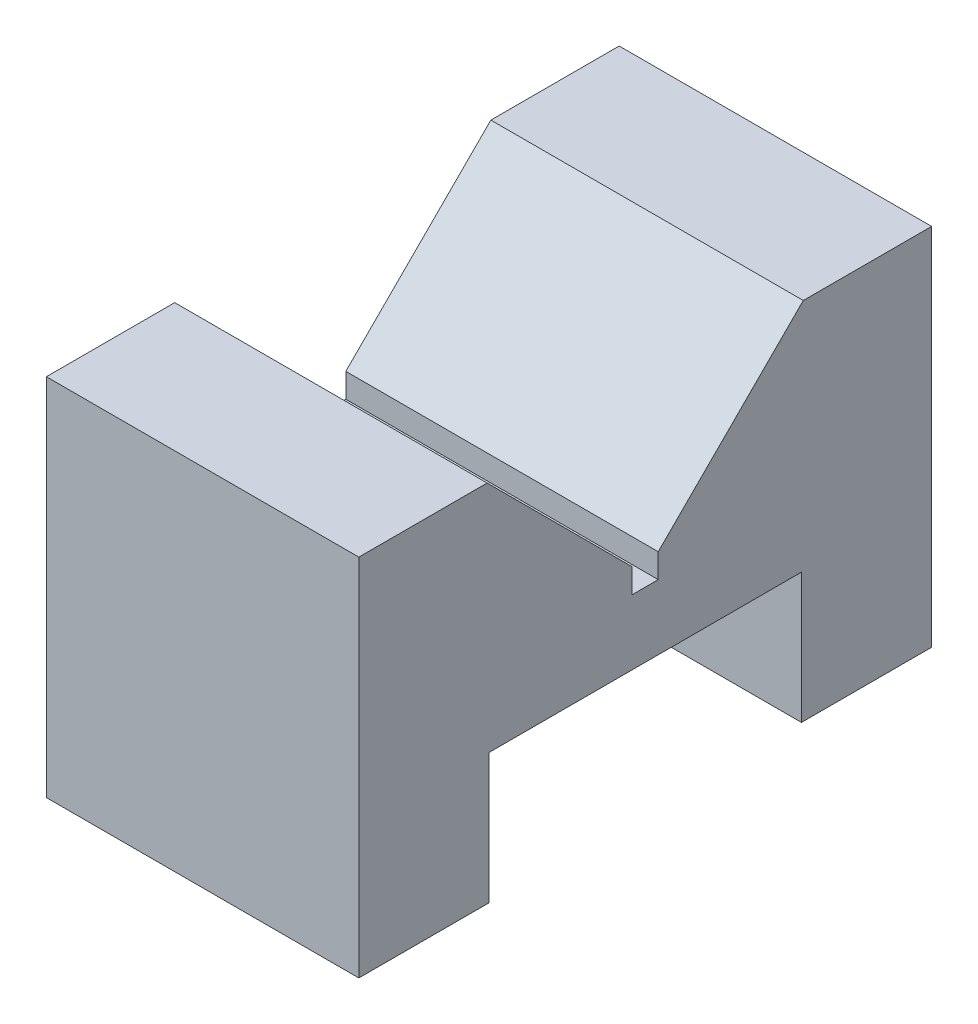
ISO-10303-21;
HEADER;
FILE_DESCRIPTION(('STEP AP214'),'2;1');
FILE_NAME('part.step','',(''),(''),'','','');
FILE_SCHEMA(('AUTOMOTIVE_DESIGN { 1 0 10303 214 1 1 1 1 }'));
ENDSEC;
DATA;
#1=APPLICATION_CONTEXT('core data for automotive mechanical design processes');
#2=APPLICATION_PROTOCOL_DEFINITION('international standard','automotive_design',2000,#1);
#3=PRODUCT_CONTEXT('',#1,'mechanical');
#4=PRODUCT('Part','Part','',(#3));
#5=PRODUCT_RELATED_PRODUCT_CATEGORY('part','',(#4));
#6=PRODUCT_DEFINITION_FORMATION('','',#4);
#7=PRODUCT_DEFINITION_CONTEXT('part definition',#1,'design');
#8=PRODUCT_DEFINITION('design','',#6,#7);
#9=PRODUCT_DEFINITION_SHAPE('','',#8);
#10=(LENGTH_UNIT() NAMED_UNIT(*) SI_UNIT(.MILLI.,.METRE.));
#11=(NAMED_UNIT(*) PLANE_ANGLE_UNIT() SI_UNIT($,.RADIAN.));
#12=(NAMED_UNIT(*) SI_UNIT($,.STERADIAN.) SOLID_ANGLE_UNIT());
#13=UNCERTAINTY_MEASURE_WITH_UNIT(LENGTH_MEASURE(1.E-05),#10,'distance_accuracy_value','');
#14=(GEOMETRIC_REPRESENTATION_CONTEXT(3) GLOBAL_UNCERTAINTY_ASSIGNED_CONTEXT((#13)) GLOBAL_UNIT_ASSIGNED_CONTEXT((#10,
#11,#12)) REPRESENTATION_CONTEXT('',''));
#15=CARTESIAN_POINT('',(0.,0.,0.));
#16=DIRECTION('',(0.,0.,1.));
#17=DIRECTION('',(1.,0.,0.));
#18=AXIS2_PLACEMENT_3D('',#15,#16,#17);
#19=CARTESIAN_POINT('',(24.,10.,12.));
#20=DIRECTION('',(0.,0.,1.));
#21=DIRECTION('',(0.,-1.,0.));
#22=AXIS2_PLACEMENT_3D('',#19,#20,#21);
#23=PLANE('',#22);
#24=DIRECTION('',(0.,1.,0.));
#25=VECTOR('',#24,1.);
#26=CARTESIAN_POINT('',(0.,10.,12.));
#27=LINE('',#26,#25);
#28=CARTESIAN_POINT('',(0.,0.,12.));
#29=VERTEX_POINT('',#28);
#30=CARTESIAN_POINT('',(0.,10.,12.));
#31=VERTEX_POINT('',#30);
#32=EDGE_CURVE('E182',#29,#31,#27,.T.);
#33=ORIENTED_EDGE('',*,*,#32,.T.);
#34=DIRECTION('',(-1.,0.,0.));
#35=VECTOR('',#34,1.);
#36=CARTESIAN_POINT('',(24.,10.,12.));
#37=LINE('',#36,#35);
#38=CARTESIAN_POINT('',(24.,10.,12.));
#39=VERTEX_POINT('',#38);
#40=EDGE_CURVE('E11',#39,#31,#37,.T.);
#41=ORIENTED_EDGE('',*,*,#40,.F.);
#42=DIRECTION('',(0.,1.,0.));
#43=VECTOR('',#42,1.);
#44=CARTESIAN_POINT('',(24.,10.,12.));
#45=LINE('',#44,#43);
#46=CARTESIAN_POINT('',(24.,0.,12.));
#47=VERTEX_POINT('',#46);
#48=EDGE_CURVE('E209',#47,#39,#45,.T.);
#49=ORIENTED_EDGE('',*,*,#48,.F.);
#50=DIRECTION('',(-1.,0.,0.));
#51=VECTOR('',#50,1.);
#52=CARTESIAN_POINT('',(24.,0.,12.));
#53=LINE('',#52,#51);
#54=EDGE_CURVE('E178',#47,#29,#53,.T.);
#55=ORIENTED_EDGE('',*,*,#54,.T.);
#56=EDGE_LOOP('',(#33,#41,#49,#55));
#57=FACE_BOUND('',#56,.T.);
#58=ADVANCED_FACE('F47',(#57),#23,.F.);
#59=CARTESIAN_POINT('',(24.,10.,-12.));
#60=DIRECTION('',(0.,1.,0.));
#61=DIRECTION('',(0.,0.,1.));
#62=AXIS2_PLACEMENT_3D('',#59,#60,#61);
#63=PLANE('',#62);
#64=DIRECTION('',(0.,0.,-1.));
#65=VECTOR('',#64,1.);
#66=CARTESIAN_POINT('',(0.,10.,-12.));
#67=LINE('',#66,#65);
#68=CARTESIAN_POINT('',(0.,10.,-12.));
#69=VERTEX_POINT('',#68);
#70=EDGE_CURVE('E185',#31,#69,#67,.T.);
#71=ORIENTED_EDGE('',*,*,#70,.T.);
#72=DIRECTION('',(-1.,0.,0.));
#73=VECTOR('',#72,1.);
#74=CARTESIAN_POINT('',(24.,10.,-12.));
#75=LINE('',#74,#73);
#76=CARTESIAN_POINT('',(24.,10.,-12.));
#77=VERTEX_POINT('',#76);
#78=EDGE_CURVE('E55',#77,#69,#75,.T.);
#79=ORIENTED_EDGE('',*,*,#78,.F.);
#80=DIRECTION('',(0.,0.,-1.));
#81=VECTOR('',#80,1.);
#82=CARTESIAN_POINT('',(24.,10.,-12.));
#83=LINE('',#82,#81);
#84=EDGE_CURVE('E125',#39,#77,#83,.T.);
#85=ORIENTED_EDGE('',*,*,#84,.F.);
#86=ORIENTED_EDGE('',*,*,#40,.T.);
#87=EDGE_LOOP('',(#71,#79,#85,#86));
#88=FACE_BOUND('',#87,.T.);
#89=ADVANCED_FACE('F301',(#88),#63,.F.);
#90=CARTESIAN_POINT('',(24.,10.,-12.));
#91=DIRECTION('',(0.,0.,-1.));
#92=DIRECTION('',(0.,1.,0.));
#93=AXIS2_PLACEMENT_3D('',#90,#91,#92);
#94=PLANE('',#93);
#95=DIRECTION('',(0.,-1.,0.));
#96=VECTOR('',#95,1.);
#97=CARTESIAN_POINT('',(0.,10.,-12.));
#98=LINE('',#97,#96);
#99=CARTESIAN_POINT('',(0.,0.,-12.));
#100=VERTEX_POINT('',#99);
#101=EDGE_CURVE('E188',#69,#100,#98,.T.);
#102=ORIENTED_EDGE('',*,*,#101,.T.);
#103=DIRECTION('',(-1.,0.,0.));
#104=VECTOR('',#103,1.);
#105=CARTESIAN_POINT('',(24.,0.,-12.));
#106=LINE('',#105,#104);
#107=CARTESIAN_POINT('',(24.,0.,-12.));
#108=VERTEX_POINT('',#107);
#109=EDGE_CURVE('E234',#108,#100,#106,.T.);
#110=ORIENTED_EDGE('',*,*,#109,.F.);
#111=DIRECTION('',(0.,-1.,0.));
#112=VECTOR('',#111,1.);
#113=CARTESIAN_POINT('',(24.,10.,-12.));
#114=LINE('',#113,#112);
#115=EDGE_CURVE('E242',#77,#108,#114,.T.);
#116=ORIENTED_EDGE('',*,*,#115,.F.);
#117=ORIENTED_EDGE('',*,*,#78,.T.);
#118=EDGE_LOOP('',(#102,#110,#116,#117));
#119=FACE_BOUND('',#118,.T.);
#120=ADVANCED_FACE('F240',(#119),#94,.F.);
#121=CARTESIAN_POINT('',(24.,0.,-12.));
#122=DIRECTION('',(0.,1.,0.));
#123=DIRECTION('',(0.,0.,1.));
#124=AXIS2_PLACEMENT_3D('',#121,#122,#123);
#125=PLANE('',#124);
#126=CARTESIAN_POINT('',(13.,0.,-17.));
#127=DIRECTION('',(0.,-1.,0.));
#128=DIRECTION('',(0.,0.,-1.));
#129=AXIS2_PLACEMENT_3D('',#126,#127,#128);
#130=CIRCLE('',#129,2.09999999999999);
#131=CARTESIAN_POINT('',(13.,0.,-19.1));
#132=VERTEX_POINT('',#131);
#133=EDGE_CURVE('E413',#132,#132,#130,.T.);
#134=ORIENTED_EDGE('',*,*,#133,.F.);
#135=EDGE_LOOP('',(#134));
#136=FACE_BOUND('',#135,.T.);
#137=DIRECTION('',(0.,0.,-1.));
#138=VECTOR('',#137,1.);
#139=CARTESIAN_POINT('',(0.,0.,-12.));
#140=LINE('',#139,#138);
#141=CARTESIAN_POINT('',(0.,0.,-22.));
#142=VERTEX_POINT('',#141);
#143=EDGE_CURVE('E190',#100,#142,#140,.T.);
#144=ORIENTED_EDGE('',*,*,#143,.T.);
#145=DIRECTION('',(-1.,0.,0.));
#146=VECTOR('',#145,1.);
#147=CARTESIAN_POINT('',(24.,0.,-22.));
#148=LINE('',#147,#146);
#149=CARTESIAN_POINT('',(24.,0.,-22.));
#150=VERTEX_POINT('',#149);
#151=EDGE_CURVE('E231',#150,#142,#148,.T.);
#152=ORIENTED_EDGE('',*,*,#151,.F.);
#153=DIRECTION('',(0.,0.,-1.));
#154=VECTOR('',#153,1.);
#155=CARTESIAN_POINT('',(24.,0.,-12.));
#156=LINE('',#155,#154);
#157=EDGE_CURVE('E260',#108,#150,#156,.T.);
#158=ORIENTED_EDGE('',*,*,#157,.F.);
#159=ORIENTED_EDGE('',*,*,#109,.T.);
#160=EDGE_LOOP('',(#144,#152,#158,#159));
#161=FACE_BOUND('',#160,.T.);
#162=ADVANCED_FACE('F251',(#136,#161),#125,.F.);
#163=CARTESIAN_POINT('',(24.,0.,-22.));
#164=DIRECTION('',(0.,0.,1.));
#165=DIRECTION('',(1.,0.,0.));
#166=AXIS2_PLACEMENT_3D('',#163,#164,#165);
#167=PLANE('',#166);
#168=DIRECTION('',(0.,1.,0.));
#169=VECTOR('',#168,1.);
#170=CARTESIAN_POINT('',(0.,0.,-22.));
#171=LINE('',#170,#169);
#172=CARTESIAN_POINT('',(0.,28.,-22.));
#173=VERTEX_POINT('',#172);
#174=EDGE_CURVE('E192',#142,#173,#171,.T.);
#175=ORIENTED_EDGE('',*,*,#174,.T.);
#176=DIRECTION('',(-1.,0.,0.));
#177=VECTOR('',#176,1.);
#178=CARTESIAN_POINT('',(24.,28.,-22.));
#179=LINE('',#178,#177);
#180=CARTESIAN_POINT('',(24.,28.,-22.));
#181=VERTEX_POINT('',#180);
#182=EDGE_CURVE('E228',#181,#173,#179,.T.);
#183=ORIENTED_EDGE('',*,*,#182,.F.);
#184=DIRECTION('',(0.,1.,0.));
#185=VECTOR('',#184,1.);
#186=CARTESIAN_POINT('',(24.,0.,-22.));
#187=LINE('',#186,#185);
#188=EDGE_CURVE('E257',#150,#181,#187,.T.);
#189=ORIENTED_EDGE('',*,*,#188,.F.);
#190=ORIENTED_EDGE('',*,*,#151,.T.);
#191=EDGE_LOOP('',(#175,#183,#189,#190));
#192=FACE_BOUND('',#191,.T.);
#193=ADVANCED_FACE('F255',(#192),#167,.F.);
#194=CARTESIAN_POINT('',(24.,28.,-22.));
#195=DIRECTION('',(0.,-1.,0.));
#196=DIRECTION('',(0.,0.,-1.));
#197=AXIS2_PLACEMENT_3D('',#194,#195,#196);
#198=PLANE('',#197);
#199=DIRECTION('',(0.,0.,1.));
#200=VECTOR('',#199,1.);
#201=CARTESIAN_POINT('',(0.,28.,-22.));
#202=LINE('',#201,#200);
#203=CARTESIAN_POINT('',(0.,28.,-12.142135623731));
#204=VERTEX_POINT('',#203);
#205=EDGE_CURVE('E194',#173,#204,#202,.T.);
#206=ORIENTED_EDGE('',*,*,#205,.T.);
#207=DIRECTION('',(-1.,0.,0.));
#208=VECTOR('',#207,1.);
#209=CARTESIAN_POINT('',(24.,28.,-12.142135623731));
#210=LINE('',#209,#208);
#211=CARTESIAN_POINT('',(24.,28.,-12.142135623731));
#212=VERTEX_POINT('',#211);
#213=EDGE_CURVE('E225',#212,#204,#210,.T.);
#214=ORIENTED_EDGE('',*,*,#213,.F.);
#215=DIRECTION('',(0.,0.,1.));
#216=VECTOR('',#215,1.);
#217=CARTESIAN_POINT('',(24.,28.,-22.));
#218=LINE('',#217,#216);
#219=EDGE_CURVE('E259',#181,#212,#218,.T.);
#220=ORIENTED_EDGE('',*,*,#219,.F.);
#221=ORIENTED_EDGE('',*,*,#182,.T.);
#222=EDGE_LOOP('',(#206,#214,#220,#221));
#223=FACE_BOUND('',#222,.T.);
#224=ADVANCED_FACE('F315',(#223),#198,.F.);
#225=CARTESIAN_POINT('',(24.,28.,-12.142135623731));
#226=DIRECTION('',(0.,-0.707106781186548,-0.707106781186547));
#227=DIRECTION('',(0.,0.707106781186547,-0.707106781186548));
#228=AXIS2_PLACEMENT_3D('',#225,#226,#227);
#229=PLANE('',#228);
#230=DIRECTION('',(0.,-0.707106781186547,0.707106781186548));
#231=VECTOR('',#230,1.);
#232=CARTESIAN_POINT('',(0.,28.,-12.142135623731));
#233=LINE('',#232,#231);
#234=CARTESIAN_POINT('',(0.,16.8578643762691,-1.));
#235=VERTEX_POINT('',#234);
#236=EDGE_CURVE('E196',#204,#235,#233,.T.);
#237=ORIENTED_EDGE('',*,*,#236,.T.);
#238=DIRECTION('',(-1.,0.,0.));
#239=VECTOR('',#238,1.);
#240=CARTESIAN_POINT('',(24.,16.8578643762691,-1.));
#241=LINE('',#240,#239);
#242=CARTESIAN_POINT('',(24.,16.8578643762691,-1.));
#243=VERTEX_POINT('',#242);
#244=EDGE_CURVE('E222',#243,#235,#241,.T.);
#245=ORIENTED_EDGE('',*,*,#244,.F.);
#246=DIRECTION('',(0.,-0.707106781186547,0.707106781186548));
#247=VECTOR('',#246,1.);
#248=CARTESIAN_POINT('',(24.,28.,-12.142135623731));
#249=LINE('',#248,#247);
#250=EDGE_CURVE('E262',#212,#243,#249,.T.);
#251=ORIENTED_EDGE('',*,*,#250,.F.);
#252=ORIENTED_EDGE('',*,*,#213,.T.);
#253=EDGE_LOOP('',(#237,#245,#251,#252));
#254=FACE_BOUND('',#253,.T.);
#255=ADVANCED_FACE('F318',(#254),#229,.F.);
#256=CARTESIAN_POINT('',(24.,16.8578643762691,-1.));
#257=DIRECTION('',(0.,0.,-1.));
#258=DIRECTION('',(0.,1.,0.));
#259=AXIS2_PLACEMENT_3D('',#256,#257,#258);
#260=PLANE('',#259);
#261=DIRECTION('',(0.,-1.,0.));
#262=VECTOR('',#261,1.);
#263=CARTESIAN_POINT('',(0.,16.8578643762691,-1.));
#264=LINE('',#263,#262);
#265=CARTESIAN_POINT('',(0.,15.,-1.));
#266=VERTEX_POINT('',#265);
#267=EDGE_CURVE('E198',#235,#266,#264,.T.);
#268=ORIENTED_EDGE('',*,*,#267,.T.);
#269=DIRECTION('',(-1.,0.,0.));
#270=VECTOR('',#269,1.);
#271=CARTESIAN_POINT('',(24.,15.,-1.));
#272=LINE('',#271,#270);
#273=CARTESIAN_POINT('',(24.,15.,-1.));
#274=VERTEX_POINT('',#273);
#275=EDGE_CURVE('E219',#274,#266,#272,.T.);
#276=ORIENTED_EDGE('',*,*,#275,.F.);
#277=DIRECTION('',(0.,-1.,0.));
#278=VECTOR('',#277,1.);
#279=CARTESIAN_POINT('',(24.,16.8578643762691,-1.));
#280=LINE('',#279,#278);
#281=EDGE_CURVE('E268',#243,#274,#280,.T.);
#282=ORIENTED_EDGE('',*,*,#281,.F.);
#283=ORIENTED_EDGE('',*,*,#244,.T.);
#284=EDGE_LOOP('',(#268,#276,#282,#283));
#285=FACE_BOUND('',#284,.T.);
#286=ADVANCED_FACE('F322',(#285),#260,.F.);
#287=CARTESIAN_POINT('',(24.,15.,0.999999999999999));
#288=DIRECTION('',(0.,-1.,0.));
#289=DIRECTION('',(0.,0.,-1.));
#290=AXIS2_PLACEMENT_3D('',#287,#288,#289);
#291=PLANE('',#290);
#292=DIRECTION('',(0.,0.,1.));
#293=VECTOR('',#292,1.);
#294=CARTESIAN_POINT('',(0.,15.,0.999999999999999));
#295=LINE('',#294,#293);
#296=CARTESIAN_POINT('',(0.,15.,0.999999999999999));
#297=VERTEX_POINT('',#296);
#298=EDGE_CURVE('E200',#266,#297,#295,.T.);
#299=ORIENTED_EDGE('',*,*,#298,.T.);
#300=DIRECTION('',(-1.,0.,0.));
#301=VECTOR('',#300,1.);
#302=CARTESIAN_POINT('',(24.,15.,0.999999999999999));
#303=LINE('',#302,#301);
#304=CARTESIAN_POINT('',(24.,15.,0.999999999999999));
#305=VERTEX_POINT('',#304);
#306=EDGE_CURVE('E216',#305,#297,#303,.T.);
#307=ORIENTED_EDGE('',*,*,#306,.F.);
#308=DIRECTION('',(0.,0.,1.));
#309=VECTOR('',#308,1.);
#310=CARTESIAN_POINT('',(24.,15.,0.999999999999999));
#311=LINE('',#310,#309);
#312=EDGE_CURVE('E270',#274,#305,#311,.T.);
#313=ORIENTED_EDGE('',*,*,#312,.F.);
#314=ORIENTED_EDGE('',*,*,#275,.T.);
#315=EDGE_LOOP('',(#299,#307,#313,#314));
#316=FACE_BOUND('',#315,.T.);
#317=ADVANCED_FACE('F326',(#316),#291,.F.);
#318=CARTESIAN_POINT('',(24.,16.8578643762691,1.));
#319=DIRECTION('',(0.,0.,1.));
#320=DIRECTION('',(0.,-1.,0.));
#321=AXIS2_PLACEMENT_3D('',#318,#319,#320);
#322=PLANE('',#321);
#323=DIRECTION('',(0.,1.,0.));
#324=VECTOR('',#323,1.);
#325=CARTESIAN_POINT('',(0.,16.8578643762691,1.));
#326=LINE('',#325,#324);
#327=CARTESIAN_POINT('',(0.,16.8578643762691,1.));
#328=VERTEX_POINT('',#327);
#329=EDGE_CURVE('E202',#297,#328,#326,.T.);
#330=ORIENTED_EDGE('',*,*,#329,.T.);
#331=DIRECTION('',(-1.,0.,0.));
#332=VECTOR('',#331,1.);
#333=CARTESIAN_POINT('',(24.,16.8578643762691,1.));
#334=LINE('',#333,#332);
#335=CARTESIAN_POINT('',(24.,16.8578643762691,1.));
#336=VERTEX_POINT('',#335);
#337=EDGE_CURVE('E213',#336,#328,#334,.T.);
#338=ORIENTED_EDGE('',*,*,#337,.F.);
#339=DIRECTION('',(0.,1.,0.));
#340=VECTOR('',#339,1.);
#341=CARTESIAN_POINT('',(24.,16.8578643762691,1.));
#342=LINE('',#341,#340);
#343=EDGE_CURVE('E272',#305,#336,#342,.T.);
#344=ORIENTED_EDGE('',*,*,#343,.F.);
#345=ORIENTED_EDGE('',*,*,#306,.T.);
#346=EDGE_LOOP('',(#330,#338,#344,#345));
#347=FACE_BOUND('',#346,.T.);
#348=ADVANCED_FACE('F278',(#347),#322,.F.);
#349=CARTESIAN_POINT('',(24.,28.,12.142135623731));
#350=DIRECTION('',(0.,-0.707106781186548,0.707106781186547));
#351=DIRECTION('',(0.,-0.707106781186547,-0.707106781186548));
#352=AXIS2_PLACEMENT_3D('',#349,#350,#351);
#353=PLANE('',#352);
#354=DIRECTION('',(0.,0.707106781186547,0.707106781186548));
#355=VECTOR('',#354,1.);
#356=CARTESIAN_POINT('',(0.,28.,12.142135623731));
#357=LINE('',#356,#355);
#358=CARTESIAN_POINT('',(0.,28.,12.142135623731));
#359=VERTEX_POINT('',#358);
#360=EDGE_CURVE('E204',#328,#359,#357,.T.);
#361=ORIENTED_EDGE('',*,*,#360,.T.);
#362=DIRECTION('',(-1.,0.,0.));
#363=VECTOR('',#362,1.);
#364=CARTESIAN_POINT('',(24.,28.,12.142135623731));
#365=LINE('',#364,#363);
#366=CARTESIAN_POINT('',(24.,28.,12.142135623731));
#367=VERTEX_POINT('',#366);
#368=EDGE_CURVE('E173',#367,#359,#365,.T.);
#369=ORIENTED_EDGE('',*,*,#368,.F.);
#370=DIRECTION('',(0.,0.707106781186547,0.707106781186548));
#371=VECTOR('',#370,1.);
#372=CARTESIAN_POINT('',(24.,28.,12.142135623731));
#373=LINE('',#372,#371);
#374=EDGE_CURVE('E164',#336,#367,#373,.T.);
#375=ORIENTED_EDGE('',*,*,#374,.F.);
#376=ORIENTED_EDGE('',*,*,#337,.T.);
#377=EDGE_LOOP('',(#361,#369,#375,#376));
#378=FACE_BOUND('',#377,.T.);
#379=ADVANCED_FACE('F282',(#378),#353,.F.);
#380=CARTESIAN_POINT('',(24.,28.,22.));
#381=DIRECTION('',(0.,-1.,0.));
#382=DIRECTION('',(0.,0.,-1.));
#383=AXIS2_PLACEMENT_3D('',#380,#381,#382);
#384=PLANE('',#383);
#385=DIRECTION('',(0.,0.,1.));
#386=VECTOR('',#385,1.);
#387=CARTESIAN_POINT('',(0.,28.,22.));
#388=LINE('',#387,#386);
#389=CARTESIAN_POINT('',(0.,28.,22.));
#390=VERTEX_POINT('',#389);
#391=EDGE_CURVE('E172',#359,#390,#388,.T.);
#392=ORIENTED_EDGE('',*,*,#391,.T.);
#393=DIRECTION('',(-1.,0.,0.));
#394=VECTOR('',#393,1.);
#395=CARTESIAN_POINT('',(24.,28.,22.));
#396=LINE('',#395,#394);
#397=CARTESIAN_POINT('',(24.,28.,22.));
#398=VERTEX_POINT('',#397);
#399=EDGE_CURVE('E169',#398,#390,#396,.T.);
#400=ORIENTED_EDGE('',*,*,#399,.F.);
#401=DIRECTION('',(0.,0.,1.));
#402=VECTOR('',#401,1.);
#403=CARTESIAN_POINT('',(24.,28.,22.));
#404=LINE('',#403,#402);
#405=EDGE_CURVE('E158',#367,#398,#404,.T.);
#406=ORIENTED_EDGE('',*,*,#405,.F.);
#407=ORIENTED_EDGE('',*,*,#368,.T.);
#408=EDGE_LOOP('',(#392,#400,#406,#407));
#409=FACE_BOUND('',#408,.T.);
#410=ADVANCED_FACE('F170',(#409),#384,.F.);
#411=CARTESIAN_POINT('',(24.,0.,22.));
#412=DIRECTION('',(0.,0.,-1.));
#413=DIRECTION('',(-1.,0.,0.));
#414=AXIS2_PLACEMENT_3D('',#411,#412,#413);
#415=PLANE('',#414);
#416=DIRECTION('',(0.,-1.,0.));
#417=VECTOR('',#416,1.);
#418=CARTESIAN_POINT('',(0.,0.,22.));
#419=LINE('',#418,#417);
#420=CARTESIAN_POINT('',(0.,0.,22.));
#421=VERTEX_POINT('',#420);
#422=EDGE_CURVE('E111',#390,#421,#419,.T.);
#423=ORIENTED_EDGE('',*,*,#422,.T.);
#424=DIRECTION('',(-1.,0.,0.));
#425=VECTOR('',#424,1.);
#426=CARTESIAN_POINT('',(24.,0.,22.));
#427=LINE('',#426,#425);
#428=CARTESIAN_POINT('',(24.,0.,22.));
#429=VERTEX_POINT('',#428);
#430=EDGE_CURVE('E174',#429,#421,#427,.T.);
#431=ORIENTED_EDGE('',*,*,#430,.F.);
#432=DIRECTION('',(0.,-1.,0.));
#433=VECTOR('',#432,1.);
#434=CARTESIAN_POINT('',(24.,0.,22.));
#435=LINE('',#434,#433);
#436=EDGE_CURVE('E162',#398,#429,#435,.T.);
#437=ORIENTED_EDGE('',*,*,#436,.F.);
#438=ORIENTED_EDGE('',*,*,#399,.T.);
#439=EDGE_LOOP('',(#423,#431,#437,#438));
#440=FACE_BOUND('',#439,.T.);
#441=ADVANCED_FACE('F176',(#440),#415,.F.);
#442=CARTESIAN_POINT('',(24.,0.,12.));
#443=DIRECTION('',(0.,1.,0.));
#444=DIRECTION('',(0.,0.,1.));
#445=AXIS2_PLACEMENT_3D('',#442,#443,#444);
#446=PLANE('',#445);
#447=CARTESIAN_POINT('',(13.,0.,17.));
#448=DIRECTION('',(0.,-1.,0.));
#449=DIRECTION('',(0.,0.,-1.));
#450=AXIS2_PLACEMENT_3D('',#447,#448,#449);
#451=CIRCLE('',#450,2.09999999999999);
#452=CARTESIAN_POINT('',(13.,0.,14.9));
#453=VERTEX_POINT('',#452);
#454=EDGE_CURVE('E415',#453,#453,#451,.T.);
#455=ORIENTED_EDGE('',*,*,#454,.F.);
#456=EDGE_LOOP('',(#455));
#457=FACE_BOUND('',#456,.T.);
#458=DIRECTION('',(0.,0.,-1.));
#459=VECTOR('',#458,1.);
#460=CARTESIAN_POINT('',(0.,0.,12.));
#461=LINE('',#460,#459);
#462=EDGE_CURVE('E117',#421,#29,#461,.T.);
#463=ORIENTED_EDGE('',*,*,#462,.T.);
#464=ORIENTED_EDGE('',*,*,#54,.F.);
#465=DIRECTION('',(0.,0.,-1.));
#466=VECTOR('',#465,1.);
#467=CARTESIAN_POINT('',(24.,0.,12.));
#468=LINE('',#467,#466);
#469=EDGE_CURVE('E63',#429,#47,#468,.T.);
#470=ORIENTED_EDGE('',*,*,#469,.F.);
#471=ORIENTED_EDGE('',*,*,#430,.T.);
#472=EDGE_LOOP('',(#463,#464,#470,#471));
#473=FACE_BOUND('',#472,.T.);
#474=ADVANCED_FACE('F286',(#457,#473),#446,.F.);
#475=CARTESIAN_POINT('',(24.,0.,0.));
#476=DIRECTION('',(-1.,0.,0.));
#477=DIRECTION('',(0.,0.,1.));
#478=AXIS2_PLACEMENT_3D('',#475,#476,#477);
#479=PLANE('',#478);
#480=ORIENTED_EDGE('',*,*,#48,.T.);
#481=ORIENTED_EDGE('',*,*,#84,.T.);
#482=ORIENTED_EDGE('',*,*,#115,.T.);
#483=ORIENTED_EDGE('',*,*,#157,.T.);
#484=ORIENTED_EDGE('',*,*,#188,.T.);
#485=ORIENTED_EDGE('',*,*,#219,.T.);
#486=ORIENTED_EDGE('',*,*,#250,.T.);
#487=ORIENTED_EDGE('',*,*,#281,.T.);
#488=ORIENTED_EDGE('',*,*,#312,.T.);
#489=ORIENTED_EDGE('',*,*,#343,.T.);
#490=ORIENTED_EDGE('',*,*,#374,.T.);
#491=ORIENTED_EDGE('',*,*,#405,.T.);
#492=ORIENTED_EDGE('',*,*,#436,.T.);
#493=ORIENTED_EDGE('',*,*,#469,.T.);
#494=EDGE_LOOP('',(#480,#481,#482,#483,#484,#485,#486,#487,#488,#489,#490,#491,#492,#493));
#495=FACE_BOUND('',#494,.T.);
#496=ADVANCED_FACE('F160',(#495),#479,.F.);
#497=CARTESIAN_POINT('',(0.,0.,0.));
#498=DIRECTION('',(-1.,0.,0.));
#499=DIRECTION('',(0.,0.,1.));
#500=AXIS2_PLACEMENT_3D('',#497,#498,#499);
#501=PLANE('',#500);
#502=ORIENTED_EDGE('',*,*,#32,.F.);
#503=ORIENTED_EDGE('',*,*,#462,.F.);
#504=ORIENTED_EDGE('',*,*,#422,.F.);
#505=ORIENTED_EDGE('',*,*,#391,.F.);
#506=ORIENTED_EDGE('',*,*,#360,.F.);
#507=ORIENTED_EDGE('',*,*,#329,.F.);
#508=ORIENTED_EDGE('',*,*,#298,.F.);
#509=ORIENTED_EDGE('',*,*,#267,.F.);
#510=ORIENTED_EDGE('',*,*,#236,.F.);
#511=ORIENTED_EDGE('',*,*,#205,.F.);
#512=ORIENTED_EDGE('',*,*,#174,.F.);
#513=ORIENTED_EDGE('',*,*,#143,.F.);
#514=ORIENTED_EDGE('',*,*,#101,.F.);
#515=ORIENTED_EDGE('',*,*,#70,.F.);
#516=EDGE_LOOP('',(#502,#503,#504,#505,#506,#507,#508,#509,#510,#511,#512,#513,#514,#515));
#517=FACE_BOUND('',#516,.T.);
#518=ADVANCED_FACE('F246',(#517),#501,.T.);
#519=CARTESIAN_POINT('',(13.,12.,17.));
#520=DIRECTION('',(0.,-1.,0.));
#521=DIRECTION('',(0.,0.,-1.));
#522=AXIS2_PLACEMENT_3D('',#519,#520,#521);
#523=CONICAL_SURFACE('',#522,2.09999999999999,1.02974425867665);
#524=CARTESIAN_POINT('',(13.,13.2618072999579,17.));
#525=VERTEX_POINT('',#524);
#526=VERTEX_LOOP('',#525);
#527=FACE_BOUND('',#526,.T.);
#528=CARTESIAN_POINT('',(13.,12.,17.));
#529=DIRECTION('',(0.,-1.,0.));
#530=DIRECTION('',(0.,0.,-1.));
#531=AXIS2_PLACEMENT_3D('',#528,#529,#530);
#532=CIRCLE('',#531,2.09999999999999);
#533=CARTESIAN_POINT('',(13.,12.,14.9));
#534=VERTEX_POINT('',#533);
#535=EDGE_CURVE('E186',#534,#534,#532,.T.);
#536=ORIENTED_EDGE('',*,*,#535,.T.);
#537=EDGE_LOOP('',(#536));
#538=FACE_BOUND('',#537,.T.);
#539=ADVANCED_FACE('F355',(#527,#538),#523,.F.);
#540=CARTESIAN_POINT('',(13.,0.,17.));
#541=DIRECTION('',(0.,-1.,0.));
#542=DIRECTION('',(0.,0.,-1.));
#543=AXIS2_PLACEMENT_3D('',#540,#541,#542);
#544=CYLINDRICAL_SURFACE('',#543,2.09999999999999);
#545=ORIENTED_EDGE('',*,*,#535,.F.);
#546=EDGE_LOOP('',(#545));
#547=FACE_BOUND('',#546,.T.);
#548=ORIENTED_EDGE('',*,*,#454,.T.);
#549=EDGE_LOOP('',(#548));
#550=FACE_BOUND('',#549,.T.);
#551=ADVANCED_FACE('F370',(#547,#550),#544,.F.);
#552=CARTESIAN_POINT('',(13.,12.,-17.));
#553=DIRECTION('',(0.,-1.,0.));
#554=DIRECTION('',(0.,0.,-1.));
#555=AXIS2_PLACEMENT_3D('',#552,#553,#554);
#556=CONICAL_SURFACE('',#555,2.09999999999999,1.02974425867665);
#557=CARTESIAN_POINT('',(13.,13.2618072999579,-17.));
#558=VERTEX_POINT('',#557);
#559=VERTEX_LOOP('',#558);
#560=FACE_BOUND('',#559,.T.);
#561=CARTESIAN_POINT('',(13.,12.,-17.));
#562=DIRECTION('',(0.,-1.,0.));
#563=DIRECTION('',(0.,0.,-1.));
#564=AXIS2_PLACEMENT_3D('',#561,#562,#563);
#565=CIRCLE('',#564,2.09999999999999);
#566=CARTESIAN_POINT('',(13.,12.,-19.1));
#567=VERTEX_POINT('',#566);
#568=EDGE_CURVE('E410',#567,#567,#565,.T.);
#569=ORIENTED_EDGE('',*,*,#568,.T.);
#570=EDGE_LOOP('',(#569));
#571=FACE_BOUND('',#570,.T.);
#572=ADVANCED_FACE('F380',(#560,#571),#556,.F.);
#573=CARTESIAN_POINT('',(13.,0.,-17.));
#574=DIRECTION('',(0.,-1.,0.));
#575=DIRECTION('',(0.,0.,-1.));
#576=AXIS2_PLACEMENT_3D('',#573,#574,#575);
#577=CYLINDRICAL_SURFACE('',#576,2.09999999999999);
#578=ORIENTED_EDGE('',*,*,#568,.F.);
#579=EDGE_LOOP('',(#578));
#580=FACE_BOUND('',#579,.T.);
#581=ORIENTED_EDGE('',*,*,#133,.T.);
#582=EDGE_LOOP('',(#581));
#583=FACE_BOUND('',#582,.T.);
#584=ADVANCED_FACE('F390',(#580,#583),#577,.F.);
#585=CLOSED_SHELL('',(#58,#89,#120,#162,#193,#224,#255,#286,#317,#348,#379,#410,#441,#474,#496,
#518,#539,#551,#572,#584));
#586=MANIFOLD_SOLID_BREP('B2',#585);
#587=ADVANCED_BREP_SHAPE_REPRESENTATION('',(#18,#586),#14);
#588=SHAPE_DEFINITION_REPRESENTATION(#9,#587);
ENDSEC;
END-ISO-10303-21;
